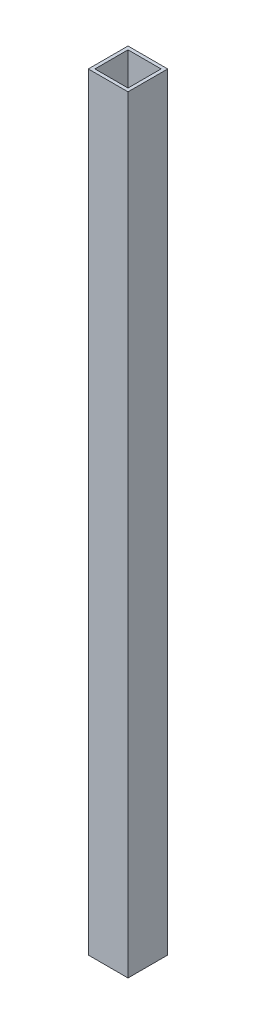
ISO-10303-21;
HEADER;
FILE_DESCRIPTION(('STEP AP214'),'2;1');
FILE_NAME('part.step','',(''),(''),'','','');
FILE_SCHEMA(('AUTOMOTIVE_DESIGN { 1 0 10303 214 1 1 1 1 }'));
ENDSEC;
DATA;
#1=APPLICATION_CONTEXT('core data for automotive mechanical design processes');
#2=APPLICATION_PROTOCOL_DEFINITION('international standard','automotive_design',2000,#1);
#3=PRODUCT_CONTEXT('',#1,'mechanical');
#4=PRODUCT('Part','Part','',(#3));
#5=PRODUCT_RELATED_PRODUCT_CATEGORY('part','',(#4));
#6=PRODUCT_DEFINITION_FORMATION('','',#4);
#7=PRODUCT_DEFINITION_CONTEXT('part definition',#1,'design');
#8=PRODUCT_DEFINITION('design','',#6,#7);
#9=PRODUCT_DEFINITION_SHAPE('','',#8);
#10=(LENGTH_UNIT() NAMED_UNIT(*) SI_UNIT(.MILLI.,.METRE.));
#11=(NAMED_UNIT(*) PLANE_ANGLE_UNIT() SI_UNIT($,.RADIAN.));
#12=(NAMED_UNIT(*) SI_UNIT($,.STERADIAN.) SOLID_ANGLE_UNIT());
#13=UNCERTAINTY_MEASURE_WITH_UNIT(LENGTH_MEASURE(1.E-05),#10,'distance_accuracy_value','');
#14=(GEOMETRIC_REPRESENTATION_CONTEXT(3) GLOBAL_UNCERTAINTY_ASSIGNED_CONTEXT((#13)) GLOBAL_UNIT_ASSIGNED_CONTEXT((#10,
#11,#12)) REPRESENTATION_CONTEXT('',''));
#15=CARTESIAN_POINT('',(0.,0.,0.));
#16=DIRECTION('',(0.,0.,1.));
#17=DIRECTION('',(1.,0.,0.));
#18=AXIS2_PLACEMENT_3D('',#15,#16,#17);
#19=CARTESIAN_POINT('',(0.,368.3,0.));
#20=DIRECTION('',(0.,-1.,0.));
#21=DIRECTION('',(0.,0.,-1.));
#22=AXIS2_PLACEMENT_3D('',#19,#20,#21);
#23=PLANE('',#22);
#24=DIRECTION('',(0.,0.,1.));
#25=VECTOR('',#24,1.);
#26=CARTESIAN_POINT('',(0.,368.3,0.));
#27=LINE('',#26,#25);
#28=CARTESIAN_POINT('',(0.,368.3,-19.05));
#29=VERTEX_POINT('',#28);
#30=CARTESIAN_POINT('',(0.,368.3,0.));
#31=VERTEX_POINT('',#30);
#32=EDGE_CURVE('E157',#29,#31,#27,.T.);
#33=ORIENTED_EDGE('',*,*,#32,.T.);
#34=DIRECTION('',(1.,0.,0.));
#35=VECTOR('',#34,1.);
#36=CARTESIAN_POINT('',(0.,368.3,0.));
#37=LINE('',#36,#35);
#38=CARTESIAN_POINT('',(19.05,368.3,0.));
#39=VERTEX_POINT('',#38);
#40=EDGE_CURVE('E160',#31,#39,#37,.T.);
#41=ORIENTED_EDGE('',*,*,#40,.T.);
#42=DIRECTION('',(0.,0.,-1.));
#43=VECTOR('',#42,1.);
#44=CARTESIAN_POINT('',(19.05,368.3,0.));
#45=LINE('',#44,#43);
#46=CARTESIAN_POINT('',(19.05,368.3,-19.05));
#47=VERTEX_POINT('',#46);
#48=EDGE_CURVE('E163',#39,#47,#45,.T.);
#49=ORIENTED_EDGE('',*,*,#48,.T.);
#50=DIRECTION('',(-1.,0.,0.));
#51=VECTOR('',#50,1.);
#52=CARTESIAN_POINT('',(0.,368.3,-19.05));
#53=LINE('',#52,#51);
#54=EDGE_CURVE('E165',#47,#29,#53,.T.);
#55=ORIENTED_EDGE('',*,*,#54,.T.);
#56=EDGE_LOOP('',(#33,#41,#49,#55));
#57=FACE_BOUND('',#56,.T.);
#58=DIRECTION('',(0.,0.,-1.));
#59=VECTOR('',#58,1.);
#60=CARTESIAN_POINT('',(17.4625,368.3,-1.5875));
#61=LINE('',#60,#59);
#62=CARTESIAN_POINT('',(17.4625,368.3,-1.5875));
#63=VERTEX_POINT('',#62);
#64=CARTESIAN_POINT('',(17.4625,368.3,-17.4625));
#65=VERTEX_POINT('',#64);
#66=EDGE_CURVE('E113',#63,#65,#61,.T.);
#67=ORIENTED_EDGE('',*,*,#66,.F.);
#68=DIRECTION('',(1.,0.,0.));
#69=VECTOR('',#68,1.);
#70=CARTESIAN_POINT('',(1.5875,368.3,-1.5875));
#71=LINE('',#70,#69);
#72=CARTESIAN_POINT('',(1.5875,368.3,-1.5875));
#73=VERTEX_POINT('',#72);
#74=EDGE_CURVE('E136',#73,#63,#71,.T.);
#75=ORIENTED_EDGE('',*,*,#74,.F.);
#76=DIRECTION('',(0.,0.,1.));
#77=VECTOR('',#76,1.);
#78=CARTESIAN_POINT('',(1.5875,368.3,-1.5875));
#79=LINE('',#78,#77);
#80=CARTESIAN_POINT('',(1.5875,368.3,-17.4625));
#81=VERTEX_POINT('',#80);
#82=EDGE_CURVE('E134',#81,#73,#79,.T.);
#83=ORIENTED_EDGE('',*,*,#82,.F.);
#84=DIRECTION('',(-1.,0.,0.));
#85=VECTOR('',#84,1.);
#86=CARTESIAN_POINT('',(1.5875,368.3,-17.4625));
#87=LINE('',#86,#85);
#88=EDGE_CURVE('E121',#65,#81,#87,.T.);
#89=ORIENTED_EDGE('',*,*,#88,.F.);
#90=EDGE_LOOP('',(#67,#75,#83,#89));
#91=FACE_BOUND('',#90,.T.);
#92=ADVANCED_FACE('F39',(#57,#91),#23,.F.);
#93=CARTESIAN_POINT('',(0.,0.,0.));
#94=DIRECTION('',(0.,-1.,0.));
#95=DIRECTION('',(0.,0.,-1.));
#96=AXIS2_PLACEMENT_3D('',#93,#94,#95);
#97=PLANE('',#96);
#98=DIRECTION('',(0.,0.,1.));
#99=VECTOR('',#98,1.);
#100=CARTESIAN_POINT('',(0.,0.,0.));
#101=LINE('',#100,#99);
#102=CARTESIAN_POINT('',(0.,0.,-19.05));
#103=VERTEX_POINT('',#102);
#104=CARTESIAN_POINT('',(0.,0.,0.));
#105=VERTEX_POINT('',#104);
#106=EDGE_CURVE('E130',#103,#105,#101,.T.);
#107=ORIENTED_EDGE('',*,*,#106,.F.);
#108=DIRECTION('',(-1.,0.,0.));
#109=VECTOR('',#108,1.);
#110=CARTESIAN_POINT('',(0.,0.,-19.05));
#111=LINE('',#110,#109);
#112=CARTESIAN_POINT('',(19.05,0.,-19.05));
#113=VERTEX_POINT('',#112);
#114=EDGE_CURVE('E161',#113,#103,#111,.T.);
#115=ORIENTED_EDGE('',*,*,#114,.F.);
#116=DIRECTION('',(0.,0.,-1.));
#117=VECTOR('',#116,1.);
#118=CARTESIAN_POINT('',(19.05,0.,0.));
#119=LINE('',#118,#117);
#120=CARTESIAN_POINT('',(19.05,0.,0.));
#121=VERTEX_POINT('',#120);
#122=EDGE_CURVE('E174',#121,#113,#119,.T.);
#123=ORIENTED_EDGE('',*,*,#122,.F.);
#124=DIRECTION('',(1.,0.,0.));
#125=VECTOR('',#124,1.);
#126=CARTESIAN_POINT('',(0.,0.,0.));
#127=LINE('',#126,#125);
#128=EDGE_CURVE('E171',#105,#121,#127,.T.);
#129=ORIENTED_EDGE('',*,*,#128,.F.);
#130=EDGE_LOOP('',(#107,#115,#123,#129));
#131=FACE_BOUND('',#130,.T.);
#132=DIRECTION('',(1.,0.,0.));
#133=VECTOR('',#132,1.);
#134=CARTESIAN_POINT('',(1.5875,0.,-1.5875));
#135=LINE('',#134,#133);
#136=CARTESIAN_POINT('',(1.5875,0.,-1.5875));
#137=VERTEX_POINT('',#136);
#138=CARTESIAN_POINT('',(17.4625,0.,-1.5875));
#139=VERTEX_POINT('',#138);
#140=EDGE_CURVE('E122',#137,#139,#135,.T.);
#141=ORIENTED_EDGE('',*,*,#140,.T.);
#142=DIRECTION('',(0.,0.,-1.));
#143=VECTOR('',#142,1.);
#144=CARTESIAN_POINT('',(17.4625,0.,-1.5875));
#145=LINE('',#144,#143);
#146=CARTESIAN_POINT('',(17.4625,0.,-17.4625));
#147=VERTEX_POINT('',#146);
#148=EDGE_CURVE('E66',#139,#147,#145,.T.);
#149=ORIENTED_EDGE('',*,*,#148,.T.);
#150=DIRECTION('',(-1.,0.,0.));
#151=VECTOR('',#150,1.);
#152=CARTESIAN_POINT('',(1.5875,0.,-17.4625));
#153=LINE('',#152,#151);
#154=CARTESIAN_POINT('',(1.5875,0.,-17.4625));
#155=VERTEX_POINT('',#154);
#156=EDGE_CURVE('E128',#147,#155,#153,.T.);
#157=ORIENTED_EDGE('',*,*,#156,.T.);
#158=DIRECTION('',(0.,0.,1.));
#159=VECTOR('',#158,1.);
#160=CARTESIAN_POINT('',(1.5875,0.,-1.5875));
#161=LINE('',#160,#159);
#162=EDGE_CURVE('E144',#155,#137,#161,.T.);
#163=ORIENTED_EDGE('',*,*,#162,.T.);
#164=EDGE_LOOP('',(#141,#149,#157,#163));
#165=FACE_BOUND('',#164,.T.);
#166=ADVANCED_FACE('F197',(#131,#165),#97,.T.);
#167=CARTESIAN_POINT('',(0.,368.3,0.));
#168=DIRECTION('',(1.,0.,0.));
#169=DIRECTION('',(0.,0.,-1.));
#170=AXIS2_PLACEMENT_3D('',#167,#168,#169);
#171=PLANE('',#170);
#172=ORIENTED_EDGE('',*,*,#106,.T.);
#173=DIRECTION('',(0.,-1.,0.));
#174=VECTOR('',#173,1.);
#175=CARTESIAN_POINT('',(0.,368.3,0.));
#176=LINE('',#175,#174);
#177=EDGE_CURVE('E11',#31,#105,#176,.T.);
#178=ORIENTED_EDGE('',*,*,#177,.F.);
#179=ORIENTED_EDGE('',*,*,#32,.F.);
#180=DIRECTION('',(0.,-1.,0.));
#181=VECTOR('',#180,1.);
#182=CARTESIAN_POINT('',(0.,368.3,-19.05));
#183=LINE('',#182,#181);
#184=EDGE_CURVE('E167',#29,#103,#183,.T.);
#185=ORIENTED_EDGE('',*,*,#184,.T.);
#186=EDGE_LOOP('',(#172,#178,#179,#185));
#187=FACE_BOUND('',#186,.T.);
#188=ADVANCED_FACE('F41',(#187),#171,.F.);
#189=CARTESIAN_POINT('',(0.,368.3,0.));
#190=DIRECTION('',(0.,0.,-1.));
#191=DIRECTION('',(-1.,0.,0.));
#192=AXIS2_PLACEMENT_3D('',#189,#190,#191);
#193=PLANE('',#192);
#194=ORIENTED_EDGE('',*,*,#128,.T.);
#195=DIRECTION('',(0.,-1.,0.));
#196=VECTOR('',#195,1.);
#197=CARTESIAN_POINT('',(19.05,368.3,0.));
#198=LINE('',#197,#196);
#199=EDGE_CURVE('E48',#39,#121,#198,.T.);
#200=ORIENTED_EDGE('',*,*,#199,.F.);
#201=ORIENTED_EDGE('',*,*,#40,.F.);
#202=ORIENTED_EDGE('',*,*,#177,.T.);
#203=EDGE_LOOP('',(#194,#200,#201,#202));
#204=FACE_BOUND('',#203,.T.);
#205=ADVANCED_FACE('F207',(#204),#193,.F.);
#206=CARTESIAN_POINT('',(19.05,368.3,0.));
#207=DIRECTION('',(-1.,0.,0.));
#208=DIRECTION('',(0.,0.,1.));
#209=AXIS2_PLACEMENT_3D('',#206,#207,#208);
#210=PLANE('',#209);
#211=ORIENTED_EDGE('',*,*,#122,.T.);
#212=DIRECTION('',(0.,-1.,0.));
#213=VECTOR('',#212,1.);
#214=CARTESIAN_POINT('',(19.05,368.3,-19.05));
#215=LINE('',#214,#213);
#216=EDGE_CURVE('E182',#47,#113,#215,.T.);
#217=ORIENTED_EDGE('',*,*,#216,.F.);
#218=ORIENTED_EDGE('',*,*,#48,.F.);
#219=ORIENTED_EDGE('',*,*,#199,.T.);
#220=EDGE_LOOP('',(#211,#217,#218,#219));
#221=FACE_BOUND('',#220,.T.);
#222=ADVANCED_FACE('F191',(#221),#210,.F.);
#223=CARTESIAN_POINT('',(0.,368.3,-19.05));
#224=DIRECTION('',(0.,0.,1.));
#225=DIRECTION('',(1.,0.,0.));
#226=AXIS2_PLACEMENT_3D('',#223,#224,#225);
#227=PLANE('',#226);
#228=ORIENTED_EDGE('',*,*,#114,.T.);
#229=ORIENTED_EDGE('',*,*,#184,.F.);
#230=ORIENTED_EDGE('',*,*,#54,.F.);
#231=ORIENTED_EDGE('',*,*,#216,.T.);
#232=EDGE_LOOP('',(#228,#229,#230,#231));
#233=FACE_BOUND('',#232,.T.);
#234=ADVANCED_FACE('F201',(#233),#227,.F.);
#235=CARTESIAN_POINT('',(17.4625,368.3,-1.5875));
#236=DIRECTION('',(-1.,0.,0.));
#237=DIRECTION('',(0.,0.,1.));
#238=AXIS2_PLACEMENT_3D('',#235,#236,#237);
#239=PLANE('',#238);
#240=ORIENTED_EDGE('',*,*,#148,.F.);
#241=DIRECTION('',(0.,-1.,0.));
#242=VECTOR('',#241,1.);
#243=CARTESIAN_POINT('',(17.4625,368.3,-1.5875));
#244=LINE('',#243,#242);
#245=EDGE_CURVE('E117',#63,#139,#244,.T.);
#246=ORIENTED_EDGE('',*,*,#245,.F.);
#247=ORIENTED_EDGE('',*,*,#66,.T.);
#248=DIRECTION('',(0.,-1.,0.));
#249=VECTOR('',#248,1.);
#250=CARTESIAN_POINT('',(17.4625,368.3,-17.4625));
#251=LINE('',#250,#249);
#252=EDGE_CURVE('E116',#65,#147,#251,.T.);
#253=ORIENTED_EDGE('',*,*,#252,.T.);
#254=EDGE_LOOP('',(#240,#246,#247,#253));
#255=FACE_BOUND('',#254,.T.);
#256=ADVANCED_FACE('F115',(#255),#239,.T.);
#257=CARTESIAN_POINT('',(1.5875,368.3,-17.4625));
#258=DIRECTION('',(0.,0.,1.));
#259=DIRECTION('',(1.,0.,0.));
#260=AXIS2_PLACEMENT_3D('',#257,#258,#259);
#261=PLANE('',#260);
#262=ORIENTED_EDGE('',*,*,#156,.F.);
#263=ORIENTED_EDGE('',*,*,#252,.F.);
#264=ORIENTED_EDGE('',*,*,#88,.T.);
#265=DIRECTION('',(0.,-1.,0.));
#266=VECTOR('',#265,1.);
#267=CARTESIAN_POINT('',(1.5875,368.3,-17.4625));
#268=LINE('',#267,#266);
#269=EDGE_CURVE('E131',#81,#155,#268,.T.);
#270=ORIENTED_EDGE('',*,*,#269,.T.);
#271=EDGE_LOOP('',(#262,#263,#264,#270));
#272=FACE_BOUND('',#271,.T.);
#273=ADVANCED_FACE('F125',(#272),#261,.T.);
#274=CARTESIAN_POINT('',(1.5875,368.3,-1.5875));
#275=DIRECTION('',(1.,0.,0.));
#276=DIRECTION('',(0.,0.,-1.));
#277=AXIS2_PLACEMENT_3D('',#274,#275,#276);
#278=PLANE('',#277);
#279=ORIENTED_EDGE('',*,*,#162,.F.);
#280=ORIENTED_EDGE('',*,*,#269,.F.);
#281=ORIENTED_EDGE('',*,*,#82,.T.);
#282=DIRECTION('',(0.,-1.,0.));
#283=VECTOR('',#282,1.);
#284=CARTESIAN_POINT('',(1.5875,368.3,-1.5875));
#285=LINE('',#284,#283);
#286=EDGE_CURVE('E55',#73,#137,#285,.T.);
#287=ORIENTED_EDGE('',*,*,#286,.T.);
#288=EDGE_LOOP('',(#279,#280,#281,#287));
#289=FACE_BOUND('',#288,.T.);
#290=ADVANCED_FACE('F230',(#289),#278,.T.);
#291=CARTESIAN_POINT('',(1.5875,368.3,-1.5875));
#292=DIRECTION('',(0.,0.,-1.));
#293=DIRECTION('',(-1.,0.,0.));
#294=AXIS2_PLACEMENT_3D('',#291,#292,#293);
#295=PLANE('',#294);
#296=ORIENTED_EDGE('',*,*,#140,.F.);
#297=ORIENTED_EDGE('',*,*,#286,.F.);
#298=ORIENTED_EDGE('',*,*,#74,.T.);
#299=ORIENTED_EDGE('',*,*,#245,.T.);
#300=EDGE_LOOP('',(#296,#297,#298,#299));
#301=FACE_BOUND('',#300,.T.);
#302=ADVANCED_FACE('F234',(#301),#295,.T.);
#303=CLOSED_SHELL('',(#92,#166,#188,#205,#222,#234,#256,#273,#290,#302));
#304=MANIFOLD_SOLID_BREP('B2',#303);
#305=ADVANCED_BREP_SHAPE_REPRESENTATION('',(#18,#304),#14);
#306=SHAPE_DEFINITION_REPRESENTATION(#9,#305);
ENDSEC;
END-ISO-10303-21;
